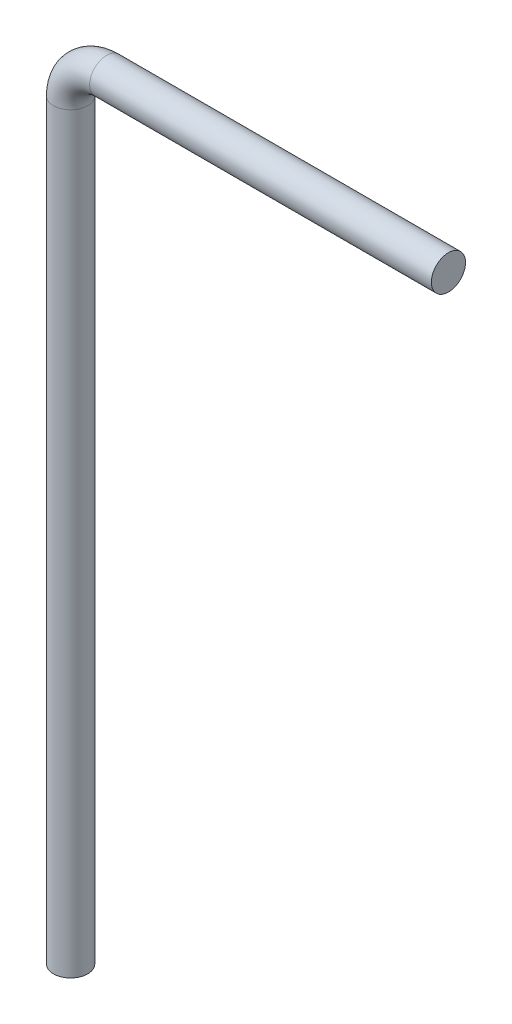
ISO-10303-21;
HEADER;
FILE_DESCRIPTION(('STEP AP214'),'2;1');
FILE_NAME('part.step','',(''),(''),'','','');
FILE_SCHEMA(('AUTOMOTIVE_DESIGN { 1 0 10303 214 1 1 1 1 }'));
ENDSEC;
DATA;
#1=APPLICATION_CONTEXT('core data for automotive mechanical design processes');
#2=APPLICATION_PROTOCOL_DEFINITION('international standard','automotive_design',2000,#1);
#3=PRODUCT_CONTEXT('',#1,'mechanical');
#4=PRODUCT('Part','Part','',(#3));
#5=PRODUCT_RELATED_PRODUCT_CATEGORY('part','',(#4));
#6=PRODUCT_DEFINITION_FORMATION('','',#4);
#7=PRODUCT_DEFINITION_CONTEXT('part definition',#1,'design');
#8=PRODUCT_DEFINITION('design','',#6,#7);
#9=PRODUCT_DEFINITION_SHAPE('','',#8);
#10=(LENGTH_UNIT() NAMED_UNIT(*) SI_UNIT(.MILLI.,.METRE.));
#11=(NAMED_UNIT(*) PLANE_ANGLE_UNIT() SI_UNIT($,.RADIAN.));
#12=(NAMED_UNIT(*) SI_UNIT($,.STERADIAN.) SOLID_ANGLE_UNIT());
#13=UNCERTAINTY_MEASURE_WITH_UNIT(LENGTH_MEASURE(1.E-05),#10,'distance_accuracy_value','');
#14=(GEOMETRIC_REPRESENTATION_CONTEXT(3) GLOBAL_UNCERTAINTY_ASSIGNED_CONTEXT((#13)) GLOBAL_UNIT_ASSIGNED_CONTEXT((#10,
#11,#12)) REPRESENTATION_CONTEXT('',''));
#15=CARTESIAN_POINT('',(0.,0.,0.));
#16=DIRECTION('',(0.,0.,1.));
#17=DIRECTION('',(1.,0.,0.));
#18=AXIS2_PLACEMENT_3D('',#15,#16,#17);
#19=CARTESIAN_POINT('',(0.,-55.,0.));
#20=DIRECTION('',(0.,-1.,0.));
#21=DIRECTION('',(0.,0.,1.));
#22=AXIS2_PLACEMENT_3D('',#19,#20,#21);
#23=PLANE('',#22);
#24=CARTESIAN_POINT('',(0.,-55.,0.));
#25=DIRECTION('',(0.,-1.,0.));
#26=DIRECTION('',(0.,0.,1.));
#27=AXIS2_PLACEMENT_3D('',#24,#25,#26);
#28=CIRCLE('',#27,2.5);
#29=CARTESIAN_POINT('',(0.,-55.,2.5));
#30=VERTEX_POINT('',#29);
#31=EDGE_CURVE('E61',#30,#30,#28,.T.);
#32=ORIENTED_EDGE('',*,*,#31,.T.);
#33=EDGE_LOOP('',(#32));
#34=FACE_BOUND('',#33,.T.);
#35=ADVANCED_FACE('F51',(#34),#23,.T.);
#36=CARTESIAN_POINT('',(55.2783331549207,60.2783331549207,0.));
#37=DIRECTION('',(-1.,0.,0.));
#38=DIRECTION('',(0.,0.,1.));
#39=AXIS2_PLACEMENT_3D('',#36,#37,#38);
#40=PLANE('',#39);
#41=CARTESIAN_POINT('',(55.2783331549207,60.2783331549207,0.));
#42=DIRECTION('',(-1.,0.,0.));
#43=DIRECTION('',(0.,0.,1.));
#44=AXIS2_PLACEMENT_3D('',#41,#42,#43);
#45=CIRCLE('',#44,2.5);
#46=CARTESIAN_POINT('',(55.2783331549207,60.2783331549207,2.5));
#47=VERTEX_POINT('',#46);
#48=EDGE_CURVE('E11',#47,#47,#45,.T.);
#49=ORIENTED_EDGE('',*,*,#48,.F.);
#50=EDGE_LOOP('',(#49));
#51=FACE_BOUND('',#50,.T.);
#52=ADVANCED_FACE('F71',(#51),#40,.F.);
#53=CARTESIAN_POINT('',(0.,-55.,0.));
#54=DIRECTION('',(0.,1.,0.));
#55=DIRECTION('',(0.,0.,1.));
#56=AXIS2_PLACEMENT_3D('',#53,#54,#55);
#57=CYLINDRICAL_SURFACE('',#56,2.5);
#58=CARTESIAN_POINT('',(0.,55.,0.));
#59=DIRECTION('',(0.,-1.,0.));
#60=DIRECTION('',(0.,0.,1.));
#61=AXIS2_PLACEMENT_3D('',#58,#59,#60);
#62=CIRCLE('',#61,2.5);
#63=CARTESIAN_POINT('',(-2.5,55.,0.));
#64=VERTEX_POINT('',#63);
#65=EDGE_CURVE('E62',#64,#64,#62,.T.);
#66=ORIENTED_EDGE('',*,*,#65,.T.);
#67=EDGE_LOOP('',(#66));
#68=FACE_BOUND('',#67,.T.);
#69=ORIENTED_EDGE('',*,*,#31,.F.);
#70=EDGE_LOOP('',(#69));
#71=FACE_BOUND('',#70,.T.);
#72=ADVANCED_FACE('F75',(#68,#71),#57,.T.);
#73=CARTESIAN_POINT('',(5.2783331549207,55.,0.));
#74=DIRECTION('',(0.,0.,-1.));
#75=DIRECTION('',(-1.,0.,0.));
#76=AXIS2_PLACEMENT_3D('',#73,#74,#75);
#77=TOROIDAL_SURFACE('',#76,5.2783331549207,2.5);
#78=CARTESIAN_POINT('',(5.27833315492065,60.2783331549208,0.));
#79=DIRECTION('',(-1.,0.,0.));
#80=DIRECTION('',(0.,0.,1.));
#81=AXIS2_PLACEMENT_3D('',#78,#79,#80);
#82=CIRCLE('',#81,2.5);
#83=CARTESIAN_POINT('',(5.27833315492062,62.7783331549207,0.));
#84=VERTEX_POINT('',#83);
#85=EDGE_CURVE('E60',#84,#84,#82,.T.);
#86=CARTESIAN_POINT('',(5.2783331549207,55.,0.));
#87=DIRECTION('',(0.,0.,-1.));
#88=DIRECTION('',(-1.,0.,0.));
#89=AXIS2_PLACEMENT_3D('',#86,#87,#88);
#90=CIRCLE('',#89,7.7783331549207);
#91=EDGE_CURVE('',#64,#84,#90,.T.);
#92=ORIENTED_EDGE('',*,*,#65,.F.);
#93=ORIENTED_EDGE('',*,*,#85,.T.);
#94=ORIENTED_EDGE('',*,*,#91,.T.);
#95=ORIENTED_EDGE('',*,*,#91,.F.);
#96=EDGE_LOOP('',(#92,#94,#93,#95));
#97=FACE_BOUND('',#96,.T.);
#98=ADVANCED_FACE('F74',(#97),#77,.T.);
#99=CARTESIAN_POINT('',(5.27833315492071,60.2783331549207,0.));
#100=DIRECTION('',(1.,0.,0.));
#101=DIRECTION('',(0.,0.,-1.));
#102=AXIS2_PLACEMENT_3D('',#99,#100,#101);
#103=CYLINDRICAL_SURFACE('',#102,2.5);
#104=ORIENTED_EDGE('',*,*,#48,.T.);
#105=EDGE_LOOP('',(#104));
#106=FACE_BOUND('',#105,.T.);
#107=ORIENTED_EDGE('',*,*,#85,.F.);
#108=EDGE_LOOP('',(#107));
#109=FACE_BOUND('',#108,.T.);
#110=ADVANCED_FACE('F85',(#106,#109),#103,.T.);
#111=CLOSED_SHELL('',(#35,#52,#72,#98,#110));
#112=MANIFOLD_SOLID_BREP('B2',#111);
#113=ADVANCED_BREP_SHAPE_REPRESENTATION('',(#18,#112),#14);
#114=SHAPE_DEFINITION_REPRESENTATION(#9,#113);
ENDSEC;
END-ISO-10303-21;
